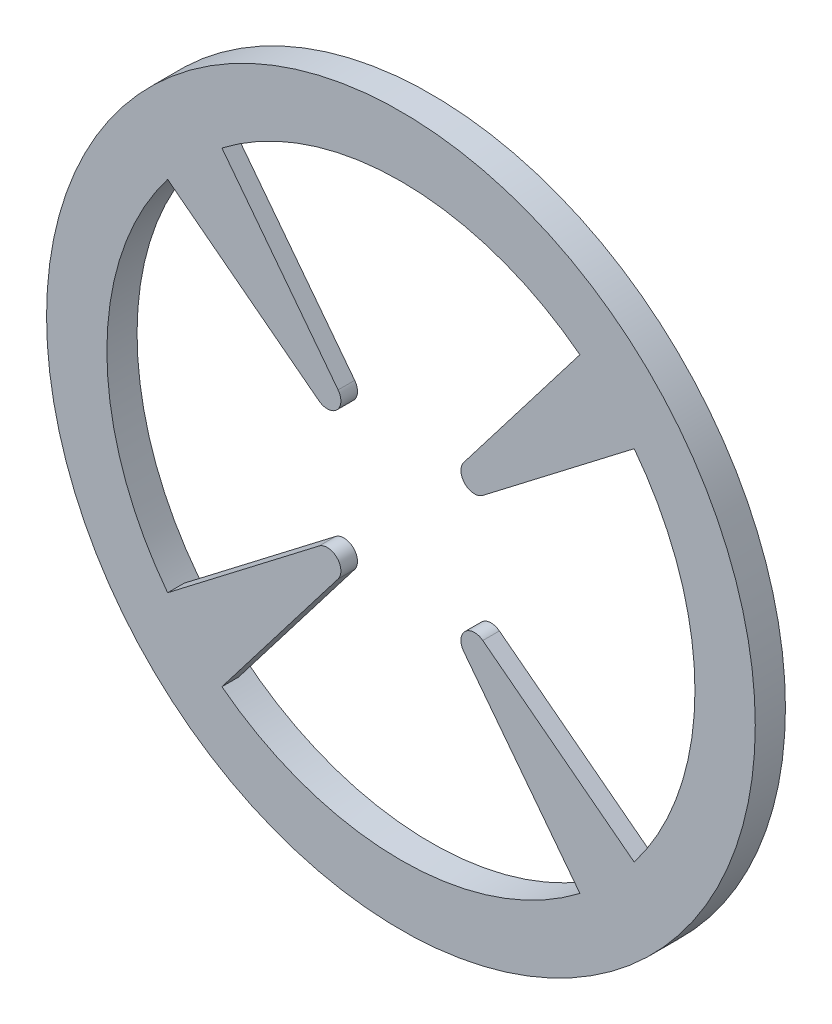
ISO-10303-21;
HEADER;
FILE_DESCRIPTION(('STEP AP214'),'2;1');
FILE_NAME('part.step','',(''),(''),'','','');
FILE_SCHEMA(('AUTOMOTIVE_DESIGN { 1 0 10303 214 1 1 1 1 }'));
ENDSEC;
DATA;
#1=APPLICATION_CONTEXT('core data for automotive mechanical design processes');
#2=APPLICATION_PROTOCOL_DEFINITION('international standard','automotive_design',2000,#1);
#3=PRODUCT_CONTEXT('',#1,'mechanical');
#4=PRODUCT('Part','Part','',(#3));
#5=PRODUCT_RELATED_PRODUCT_CATEGORY('part','',(#4));
#6=PRODUCT_DEFINITION_FORMATION('','',#4);
#7=PRODUCT_DEFINITION_CONTEXT('part definition',#1,'design');
#8=PRODUCT_DEFINITION('design','',#6,#7);
#9=PRODUCT_DEFINITION_SHAPE('','',#8);
#10=(LENGTH_UNIT() NAMED_UNIT(*) SI_UNIT(.MILLI.,.METRE.));
#11=(NAMED_UNIT(*) PLANE_ANGLE_UNIT() SI_UNIT($,.RADIAN.));
#12=(NAMED_UNIT(*) SI_UNIT($,.STERADIAN.) SOLID_ANGLE_UNIT());
#13=UNCERTAINTY_MEASURE_WITH_UNIT(LENGTH_MEASURE(1.E-05),#10,'distance_accuracy_value','');
#14=(GEOMETRIC_REPRESENTATION_CONTEXT(3) GLOBAL_UNCERTAINTY_ASSIGNED_CONTEXT((#13)) GLOBAL_UNIT_ASSIGNED_CONTEXT((#10,
#11,#12)) REPRESENTATION_CONTEXT('',''));
#15=CARTESIAN_POINT('',(0.,0.,0.));
#16=DIRECTION('',(0.,0.,1.));
#17=DIRECTION('',(1.,0.,0.));
#18=AXIS2_PLACEMENT_3D('',#15,#16,#17);
#19=CARTESIAN_POINT('',(0.,0.,0.1));
#20=DIRECTION('',(0.,0.,-1.));
#21=DIRECTION('',(-1.,0.,0.));
#22=AXIS2_PLACEMENT_3D('',#19,#20,#21);
#23=CYLINDRICAL_SURFACE('',#22,0.974760425432156);
#24=CARTESIAN_POINT('',(0.,0.,0.));
#25=DIRECTION('',(0.,0.,1.));
#26=DIRECTION('',(1.,0.,0.));
#27=AXIS2_PLACEMENT_3D('',#24,#25,#26);
#28=CIRCLE('',#27,0.974760425432156);
#29=CARTESIAN_POINT('',(0.974760425432156,0.,0.));
#30=VERTEX_POINT('',#29);
#31=EDGE_CURVE('E320',#30,#30,#28,.T.);
#32=ORIENTED_EDGE('',*,*,#31,.F.);
#33=EDGE_LOOP('',(#32));
#34=FACE_BOUND('',#33,.T.);
#35=CARTESIAN_POINT('',(0.,0.,0.045));
#36=DIRECTION('',(0.,0.,1.));
#37=DIRECTION('',(1.,0.,0.));
#38=AXIS2_PLACEMENT_3D('',#35,#36,#37);
#39=CIRCLE('',#38,0.974760425432156);
#40=CARTESIAN_POINT('',(-0.593396549527234,-0.773329439500302,0.045));
#41=VERTEX_POINT('',#40);
#42=CARTESIAN_POINT('',(-0.773329439500312,-0.593396549527221,0.045));
#43=VERTEX_POINT('',#42);
#44=EDGE_CURVE('E61',#41,#43,#39,.F.);
#45=ORIENTED_EDGE('',*,*,#44,.F.);
#46=DIRECTION('',(0.,0.,1.));
#47=VECTOR('',#46,1.);
#48=CARTESIAN_POINT('',(-0.593396549527234,-0.773329439500302,0.045));
#49=LINE('',#48,#47);
#50=CARTESIAN_POINT('',(-0.593396549527234,-0.773329439500302,0.1));
#51=VERTEX_POINT('',#50);
#52=EDGE_CURVE('E199',#41,#51,#49,.T.);
#53=ORIENTED_EDGE('',*,*,#52,.T.);
#54=CARTESIAN_POINT('',(0.,0.,0.1));
#55=DIRECTION('',(0.,0.,1.));
#56=DIRECTION('',(1.,0.,0.));
#57=AXIS2_PLACEMENT_3D('',#54,#55,#56);
#58=CIRCLE('',#57,0.974760425432156);
#59=CARTESIAN_POINT('',(0.593396549527224,-0.77332943950031,0.1));
#60=VERTEX_POINT('',#59);
#61=EDGE_CURVE('E333',#51,#60,#58,.T.);
#62=ORIENTED_EDGE('',*,*,#61,.T.);
#63=DIRECTION('',(0.,0.,1.));
#64=VECTOR('',#63,1.);
#65=CARTESIAN_POINT('',(0.593396549527224,-0.77332943950031,0.045));
#66=LINE('',#65,#64);
#67=CARTESIAN_POINT('',(0.593396549527224,-0.77332943950031,0.045));
#68=VERTEX_POINT('',#67);
#69=EDGE_CURVE('E237',#68,#60,#66,.T.);
#70=ORIENTED_EDGE('',*,*,#69,.F.);
#71=CARTESIAN_POINT('',(0.,0.,0.045));
#72=DIRECTION('',(0.,0.,1.));
#73=DIRECTION('',(1.,0.,0.));
#74=AXIS2_PLACEMENT_3D('',#71,#72,#73);
#75=CIRCLE('',#74,0.974760425432156);
#76=CARTESIAN_POINT('',(0.773329439500304,-0.593396549527231,0.045));
#77=VERTEX_POINT('',#76);
#78=EDGE_CURVE('E217',#77,#68,#75,.F.);
#79=ORIENTED_EDGE('',*,*,#78,.F.);
#80=DIRECTION('',(0.,0.,1.));
#81=VECTOR('',#80,1.);
#82=CARTESIAN_POINT('',(0.773329439500304,-0.593396549527231,0.045));
#83=LINE('',#82,#81);
#84=CARTESIAN_POINT('',(0.773329439500304,-0.593396549527231,0.1));
#85=VERTEX_POINT('',#84);
#86=EDGE_CURVE('E232',#77,#85,#83,.T.);
#87=ORIENTED_EDGE('',*,*,#86,.T.);
#88=CARTESIAN_POINT('',(0.773329439500308,0.593396549527226,0.1));
#89=VERTEX_POINT('',#88);
#90=EDGE_CURVE('E340',#85,#89,#58,.T.);
#91=ORIENTED_EDGE('',*,*,#90,.T.);
#92=DIRECTION('',(0.,0.,1.));
#93=VECTOR('',#92,1.);
#94=CARTESIAN_POINT('',(0.773329439500308,0.593396549527226,0.045));
#95=LINE('',#94,#93);
#96=CARTESIAN_POINT('',(0.773329439500308,0.593396549527226,0.045));
#97=VERTEX_POINT('',#96);
#98=EDGE_CURVE('E279',#97,#89,#95,.T.);
#99=ORIENTED_EDGE('',*,*,#98,.F.);
#100=CARTESIAN_POINT('',(0.,0.,0.045));
#101=DIRECTION('',(0.,0.,1.));
#102=DIRECTION('',(1.,0.,0.));
#103=AXIS2_PLACEMENT_3D('',#100,#101,#102);
#104=CIRCLE('',#103,0.974760425432156);
#105=CARTESIAN_POINT('',(0.593396549527228,0.773329439500306,0.045));
#106=VERTEX_POINT('',#105);
#107=EDGE_CURVE('E259',#106,#97,#104,.F.);
#108=ORIENTED_EDGE('',*,*,#107,.F.);
#109=DIRECTION('',(0.,0.,1.));
#110=VECTOR('',#109,1.);
#111=CARTESIAN_POINT('',(0.593396549527228,0.773329439500306,0.045));
#112=LINE('',#111,#110);
#113=CARTESIAN_POINT('',(0.593396549527228,0.773329439500306,0.1));
#114=VERTEX_POINT('',#113);
#115=EDGE_CURVE('E274',#106,#114,#112,.T.);
#116=ORIENTED_EDGE('',*,*,#115,.T.);
#117=CARTESIAN_POINT('',(-0.593396549527218,0.773329439500314,0.1));
#118=VERTEX_POINT('',#117);
#119=EDGE_CURVE('E334',#114,#118,#58,.T.);
#120=ORIENTED_EDGE('',*,*,#119,.T.);
#121=DIRECTION('',(0.,0.,1.));
#122=VECTOR('',#121,1.);
#123=CARTESIAN_POINT('',(-0.593396549527218,0.773329439500314,0.045));
#124=LINE('',#123,#122);
#125=CARTESIAN_POINT('',(-0.593396549527218,0.773329439500314,0.045));
#126=VERTEX_POINT('',#125);
#127=EDGE_CURVE('E321',#126,#118,#124,.T.);
#128=ORIENTED_EDGE('',*,*,#127,.F.);
#129=CARTESIAN_POINT('',(0.,0.,0.045));
#130=DIRECTION('',(0.,0.,1.));
#131=DIRECTION('',(1.,0.,0.));
#132=AXIS2_PLACEMENT_3D('',#129,#130,#131);
#133=CIRCLE('',#132,0.974760425432156);
#134=CARTESIAN_POINT('',(-0.7733294395003,0.593396549527237,0.045));
#135=VERTEX_POINT('',#134);
#136=EDGE_CURVE('E301',#135,#126,#133,.F.);
#137=ORIENTED_EDGE('',*,*,#136,.F.);
#138=DIRECTION('',(0.,0.,1.));
#139=VECTOR('',#138,1.);
#140=CARTESIAN_POINT('',(-0.7733294395003,0.593396549527237,0.045));
#141=LINE('',#140,#139);
#142=CARTESIAN_POINT('',(-0.7733294395003,0.593396549527237,0.1));
#143=VERTEX_POINT('',#142);
#144=EDGE_CURVE('E316',#135,#143,#141,.T.);
#145=ORIENTED_EDGE('',*,*,#144,.T.);
#146=CARTESIAN_POINT('',(-0.773329439500312,-0.593396549527221,0.1));
#147=VERTEX_POINT('',#146);
#148=EDGE_CURVE('E330',#143,#147,#58,.T.);
#149=ORIENTED_EDGE('',*,*,#148,.T.);
#150=DIRECTION('',(0.,0.,1.));
#151=VECTOR('',#150,1.);
#152=CARTESIAN_POINT('',(-0.773329439500312,-0.593396549527221,0.045));
#153=LINE('',#152,#151);
#154=EDGE_CURVE('E66',#43,#147,#153,.T.);
#155=ORIENTED_EDGE('',*,*,#154,.F.);
#156=EDGE_LOOP('',(#45,#53,#62,#70,#79,#87,#91,#99,#108,#116,#120,#128,#137,#145,#149,#155));
#157=FACE_BOUND('',#156,.T.);
#158=ADVANCED_FACE('F45',(#34,#157),#23,.F.);
#159=CARTESIAN_POINT('',(0.,0.,0.1));
#160=DIRECTION('',(0.,0.,1.));
#161=DIRECTION('',(1.,0.,0.));
#162=AXIS2_PLACEMENT_3D('',#159,#160,#161);
#163=PLANE('',#162);
#164=CARTESIAN_POINT('',(0.,0.,0.1));
#165=DIRECTION('',(0.,0.,1.));
#166=DIRECTION('',(1.,0.,0.));
#167=AXIS2_PLACEMENT_3D('',#164,#165,#166);
#168=CIRCLE('',#167,1.17476042543216);
#169=CARTESIAN_POINT('',(1.17476042543216,0.,0.1));
#170=VERTEX_POINT('',#169);
#171=EDGE_CURVE('E11',#170,#170,#168,.T.);
#172=ORIENTED_EDGE('',*,*,#171,.T.);
#173=EDGE_LOOP('',(#172));
#174=FACE_BOUND('',#173,.T.);
#175=ORIENTED_EDGE('',*,*,#148,.F.);
#176=DIRECTION('',(-0.793353340291228,0.608761429008729,0.));
#177=VECTOR('',#176,1.);
#178=CARTESIAN_POINT('',(0.,0.,0.1));
#179=LINE('',#178,#177);
#180=CARTESIAN_POINT('',(-0.271393831112811,0.208247810983869,0.1));
#181=VERTEX_POINT('',#180);
#182=EDGE_CURVE('E278',#181,#143,#179,.T.);
#183=ORIENTED_EDGE('',*,*,#182,.F.);
#184=CARTESIAN_POINT('',(-0.243977486679677,0.243977486679683,0.1));
#185=DIRECTION('',(0.,0.,1.));
#186=DIRECTION('',(1.,0.,0.));
#187=AXIS2_PLACEMENT_3D('',#184,#185,#186);
#188=CIRCLE('',#187,0.0450362705761065);
#189=CARTESIAN_POINT('',(-0.208247810983862,0.271393831112816,0.1));
#190=VERTEX_POINT('',#189);
#191=EDGE_CURVE('E309',#181,#190,#188,.T.);
#192=ORIENTED_EDGE('',*,*,#191,.T.);
#193=DIRECTION('',(-0.608761429008711,0.793353340291243,0.));
#194=VECTOR('',#193,1.);
#195=CARTESIAN_POINT('',(0.,0.,0.1));
#196=LINE('',#195,#194);
#197=EDGE_CURVE('E293',#190,#118,#196,.T.);
#198=ORIENTED_EDGE('',*,*,#197,.T.);
#199=ORIENTED_EDGE('',*,*,#119,.F.);
#200=DIRECTION('',(0.608761429008721,0.793353340291235,0.));
#201=VECTOR('',#200,1.);
#202=CARTESIAN_POINT('',(0.,0.,0.1));
#203=LINE('',#202,#201);
#204=CARTESIAN_POINT('',(0.208247810983866,0.271393831112813,0.1));
#205=VERTEX_POINT('',#204);
#206=EDGE_CURVE('E236',#205,#114,#203,.T.);
#207=ORIENTED_EDGE('',*,*,#206,.F.);
#208=CARTESIAN_POINT('',(0.24397748667968,0.243977486679679,0.1));
#209=DIRECTION('',(0.,0.,1.));
#210=DIRECTION('',(1.,0.,0.));
#211=AXIS2_PLACEMENT_3D('',#208,#209,#210);
#212=CIRCLE('',#211,0.0450362705761065);
#213=CARTESIAN_POINT('',(0.271393831112814,0.208247810983865,0.1));
#214=VERTEX_POINT('',#213);
#215=EDGE_CURVE('E267',#205,#214,#212,.T.);
#216=ORIENTED_EDGE('',*,*,#215,.T.);
#217=DIRECTION('',(0.793353340291236,0.608761429008719,0.));
#218=VECTOR('',#217,1.);
#219=CARTESIAN_POINT('',(0.,0.,0.1));
#220=LINE('',#219,#218);
#221=EDGE_CURVE('E251',#214,#89,#220,.T.);
#222=ORIENTED_EDGE('',*,*,#221,.T.);
#223=ORIENTED_EDGE('',*,*,#90,.F.);
#224=DIRECTION('',(0.793353340291233,-0.608761429008724,0.));
#225=VECTOR('',#224,1.);
#226=CARTESIAN_POINT('',(0.,0.,0.1));
#227=LINE('',#226,#225);
#228=CARTESIAN_POINT('',(0.271393831112813,-0.208247810983867,0.1));
#229=VERTEX_POINT('',#228);
#230=EDGE_CURVE('E198',#229,#85,#227,.T.);
#231=ORIENTED_EDGE('',*,*,#230,.F.);
#232=CARTESIAN_POINT('',(0.243977486679678,-0.243977486679681,0.1));
#233=DIRECTION('',(0.,0.,1.));
#234=DIRECTION('',(1.,0.,0.));
#235=AXIS2_PLACEMENT_3D('',#232,#233,#234);
#236=CIRCLE('',#235,0.0450362705761065);
#237=CARTESIAN_POINT('',(0.208247810983864,-0.271393831112815,0.1));
#238=VERTEX_POINT('',#237);
#239=EDGE_CURVE('E225',#229,#238,#236,.T.);
#240=ORIENTED_EDGE('',*,*,#239,.T.);
#241=DIRECTION('',(0.608761429008716,-0.793353340291238,0.));
#242=VECTOR('',#241,1.);
#243=CARTESIAN_POINT('',(0.,0.,0.1));
#244=LINE('',#243,#242);
#245=EDGE_CURVE('E209',#238,#60,#244,.T.);
#246=ORIENTED_EDGE('',*,*,#245,.T.);
#247=ORIENTED_EDGE('',*,*,#61,.F.);
#248=DIRECTION('',(-0.608761429008727,-0.793353340291231,0.));
#249=VECTOR('',#248,1.);
#250=CARTESIAN_POINT('',(0.,0.,0.1));
#251=LINE('',#250,#249);
#252=CARTESIAN_POINT('',(-0.208247810983868,-0.271393831112812,0.1));
#253=VERTEX_POINT('',#252);
#254=EDGE_CURVE('E181',#253,#51,#251,.T.);
#255=ORIENTED_EDGE('',*,*,#254,.F.);
#256=CARTESIAN_POINT('',(-0.243977486679682,-0.243977486679678,0.1));
#257=DIRECTION('',(0.,0.,1.));
#258=DIRECTION('',(1.,0.,0.));
#259=AXIS2_PLACEMENT_3D('',#256,#257,#258);
#260=CIRCLE('',#259,0.0450362705761065);
#261=CARTESIAN_POINT('',(-0.271393831112815,-0.208247810983863,0.1));
#262=VERTEX_POINT('',#261);
#263=EDGE_CURVE('E191',#253,#262,#260,.T.);
#264=ORIENTED_EDGE('',*,*,#263,.T.);
#265=DIRECTION('',(-0.793353340291241,-0.608761429008714,0.));
#266=VECTOR('',#265,1.);
#267=CARTESIAN_POINT('',(0.,0.,0.1));
#268=LINE('',#267,#266);
#269=EDGE_CURVE('E163',#262,#147,#268,.T.);
#270=ORIENTED_EDGE('',*,*,#269,.T.);
#271=EDGE_LOOP('',(#175,#183,#192,#198,#199,#207,#216,#222,#223,#231,#240,#246,#247,#255,#264,#270));
#272=FACE_BOUND('',#271,.T.);
#273=ADVANCED_FACE('F350',(#174,#272),#163,.T.);
#274=CARTESIAN_POINT('',(0.,0.,0.));
#275=DIRECTION('',(0.,0.,1.));
#276=DIRECTION('',(1.,0.,0.));
#277=AXIS2_PLACEMENT_3D('',#274,#275,#276);
#278=PLANE('',#277);
#279=CARTESIAN_POINT('',(0.,0.,0.));
#280=DIRECTION('',(0.,0.,1.));
#281=DIRECTION('',(1.,0.,0.));
#282=AXIS2_PLACEMENT_3D('',#279,#280,#281);
#283=CIRCLE('',#282,1.17476042543216);
#284=CARTESIAN_POINT('',(1.17476042543216,0.,0.));
#285=VERTEX_POINT('',#284);
#286=EDGE_CURVE('E49',#285,#285,#283,.T.);
#287=ORIENTED_EDGE('',*,*,#286,.F.);
#288=EDGE_LOOP('',(#287));
#289=FACE_BOUND('',#288,.T.);
#290=ORIENTED_EDGE('',*,*,#31,.T.);
#291=EDGE_LOOP('',(#290));
#292=FACE_BOUND('',#291,.T.);
#293=ADVANCED_FACE('F380',(#289,#292),#278,.F.);
#294=CARTESIAN_POINT('',(0.,0.,0.1));
#295=DIRECTION('',(0.,0.,-1.));
#296=DIRECTION('',(-1.,0.,0.));
#297=AXIS2_PLACEMENT_3D('',#294,#295,#296);
#298=CYLINDRICAL_SURFACE('',#297,1.17476042543216);
#299=ORIENTED_EDGE('',*,*,#171,.F.);
#300=EDGE_LOOP('',(#299));
#301=FACE_BOUND('',#300,.T.);
#302=ORIENTED_EDGE('',*,*,#286,.T.);
#303=EDGE_LOOP('',(#302));
#304=FACE_BOUND('',#303,.T.);
#305=ADVANCED_FACE('F47',(#301,#304),#298,.T.);
#306=CARTESIAN_POINT('',(0.,0.,0.045));
#307=DIRECTION('',(0.608761429008729,0.793353340291228,0.));
#308=DIRECTION('',(-0.793353340291228,0.608761429008729,0.));
#309=AXIS2_PLACEMENT_3D('',#306,#307,#308);
#310=PLANE('',#309);
#311=ORIENTED_EDGE('',*,*,#182,.T.);
#312=ORIENTED_EDGE('',*,*,#144,.F.);
#313=DIRECTION('',(-0.793353340291228,0.608761429008729,0.));
#314=VECTOR('',#313,1.);
#315=CARTESIAN_POINT('',(0.,0.,0.045));
#316=LINE('',#315,#314);
#317=CARTESIAN_POINT('',(-0.271393831112811,0.208247810983869,0.045));
#318=VERTEX_POINT('',#317);
#319=EDGE_CURVE('E288',#318,#135,#316,.T.);
#320=ORIENTED_EDGE('',*,*,#319,.F.);
#321=DIRECTION('',(0.,0.,1.));
#322=VECTOR('',#321,1.);
#323=CARTESIAN_POINT('',(-0.271393831112811,0.208247810983869,0.045));
#324=LINE('',#323,#322);
#325=EDGE_CURVE('E305',#318,#181,#324,.T.);
#326=ORIENTED_EDGE('',*,*,#325,.T.);
#327=EDGE_LOOP('',(#311,#312,#320,#326));
#328=FACE_BOUND('',#327,.T.);
#329=ADVANCED_FACE('F384',(#328),#310,.F.);
#330=CARTESIAN_POINT('',(0.,0.,0.045));
#331=DIRECTION('',(0.793353340291243,0.608761429008711,0.));
#332=DIRECTION('',(-0.608761429008711,0.793353340291243,0.));
#333=AXIS2_PLACEMENT_3D('',#330,#331,#332);
#334=PLANE('',#333);
#335=ORIENTED_EDGE('',*,*,#197,.F.);
#336=DIRECTION('',(0.,0.,1.));
#337=VECTOR('',#336,1.);
#338=CARTESIAN_POINT('',(-0.208247810983862,0.271393831112816,0.045));
#339=LINE('',#338,#337);
#340=CARTESIAN_POINT('',(-0.208247810983862,0.271393831112816,0.045));
#341=VERTEX_POINT('',#340);
#342=EDGE_CURVE('E325',#341,#190,#339,.T.);
#343=ORIENTED_EDGE('',*,*,#342,.F.);
#344=DIRECTION('',(-0.608761429008711,0.793353340291243,0.));
#345=VECTOR('',#344,1.);
#346=CARTESIAN_POINT('',(0.,0.,0.045));
#347=LINE('',#346,#345);
#348=EDGE_CURVE('E297',#341,#126,#347,.T.);
#349=ORIENTED_EDGE('',*,*,#348,.T.);
#350=ORIENTED_EDGE('',*,*,#127,.T.);
#351=EDGE_LOOP('',(#335,#343,#349,#350));
#352=FACE_BOUND('',#351,.T.);
#353=ADVANCED_FACE('F399',(#352),#334,.T.);
#354=CARTESIAN_POINT('',(-0.243977486679677,0.243977486679683,0.045));
#355=DIRECTION('',(0.,0.,1.));
#356=DIRECTION('',(1.,0.,0.));
#357=AXIS2_PLACEMENT_3D('',#354,#355,#356);
#358=CYLINDRICAL_SURFACE('',#357,0.0450362705761065);
#359=ORIENTED_EDGE('',*,*,#191,.F.);
#360=ORIENTED_EDGE('',*,*,#325,.F.);
#361=CARTESIAN_POINT('',(-0.243977486679677,0.243977486679683,0.045));
#362=DIRECTION('',(0.,0.,1.));
#363=DIRECTION('',(1.,0.,0.));
#364=AXIS2_PLACEMENT_3D('',#361,#362,#363);
#365=CIRCLE('',#364,0.0450362705761065);
#366=EDGE_CURVE('E292',#318,#341,#365,.T.);
#367=ORIENTED_EDGE('',*,*,#366,.T.);
#368=ORIENTED_EDGE('',*,*,#342,.T.);
#369=EDGE_LOOP('',(#359,#360,#367,#368));
#370=FACE_BOUND('',#369,.T.);
#371=ADVANCED_FACE('F405',(#370),#358,.T.);
#372=CARTESIAN_POINT('',(0.,0.,0.045));
#373=DIRECTION('',(0.,0.,1.));
#374=DIRECTION('',(1.,0.,0.));
#375=AXIS2_PLACEMENT_3D('',#372,#373,#374);
#376=PLANE('',#375);
#377=ORIENTED_EDGE('',*,*,#319,.T.);
#378=ORIENTED_EDGE('',*,*,#136,.T.);
#379=ORIENTED_EDGE('',*,*,#348,.F.);
#380=ORIENTED_EDGE('',*,*,#366,.F.);
#381=EDGE_LOOP('',(#377,#378,#379,#380));
#382=FACE_BOUND('',#381,.T.);
#383=ADVANCED_FACE('F435',(#382),#376,.F.);
#384=CARTESIAN_POINT('',(0.,0.,0.045));
#385=DIRECTION('',(0.793353340291235,-0.608761429008721,0.));
#386=DIRECTION('',(0.608761429008721,0.793353340291235,0.));
#387=AXIS2_PLACEMENT_3D('',#384,#385,#386);
#388=PLANE('',#387);
#389=ORIENTED_EDGE('',*,*,#206,.T.);
#390=ORIENTED_EDGE('',*,*,#115,.F.);
#391=DIRECTION('',(0.608761429008721,0.793353340291235,0.));
#392=VECTOR('',#391,1.);
#393=CARTESIAN_POINT('',(0.,0.,0.045));
#394=LINE('',#393,#392);
#395=CARTESIAN_POINT('',(0.208247810983866,0.271393831112813,0.045));
#396=VERTEX_POINT('',#395);
#397=EDGE_CURVE('E246',#396,#106,#394,.T.);
#398=ORIENTED_EDGE('',*,*,#397,.F.);
#399=DIRECTION('',(0.,0.,1.));
#400=VECTOR('',#399,1.);
#401=CARTESIAN_POINT('',(0.208247810983866,0.271393831112813,0.045));
#402=LINE('',#401,#400);
#403=EDGE_CURVE('E263',#396,#205,#402,.T.);
#404=ORIENTED_EDGE('',*,*,#403,.T.);
#405=EDGE_LOOP('',(#389,#390,#398,#404));
#406=FACE_BOUND('',#405,.T.);
#407=ADVANCED_FACE('F421',(#406),#388,.F.);
#408=CARTESIAN_POINT('',(0.,0.,0.045));
#409=DIRECTION('',(0.608761429008719,-0.793353340291236,0.));
#410=DIRECTION('',(0.793353340291236,0.608761429008719,0.));
#411=AXIS2_PLACEMENT_3D('',#408,#409,#410);
#412=PLANE('',#411);
#413=ORIENTED_EDGE('',*,*,#221,.F.);
#414=DIRECTION('',(0.,0.,1.));
#415=VECTOR('',#414,1.);
#416=CARTESIAN_POINT('',(0.271393831112814,0.208247810983865,0.045));
#417=LINE('',#416,#415);
#418=CARTESIAN_POINT('',(0.271393831112814,0.208247810983865,0.045));
#419=VERTEX_POINT('',#418);
#420=EDGE_CURVE('E283',#419,#214,#417,.T.);
#421=ORIENTED_EDGE('',*,*,#420,.F.);
#422=DIRECTION('',(0.793353340291236,0.608761429008719,0.));
#423=VECTOR('',#422,1.);
#424=CARTESIAN_POINT('',(0.,0.,0.045));
#425=LINE('',#424,#423);
#426=EDGE_CURVE('E255',#419,#97,#425,.T.);
#427=ORIENTED_EDGE('',*,*,#426,.T.);
#428=ORIENTED_EDGE('',*,*,#98,.T.);
#429=EDGE_LOOP('',(#413,#421,#427,#428));
#430=FACE_BOUND('',#429,.T.);
#431=ADVANCED_FACE('F426',(#430),#412,.T.);
#432=CARTESIAN_POINT('',(0.24397748667968,0.243977486679679,0.045));
#433=DIRECTION('',(0.,0.,1.));
#434=DIRECTION('',(1.,0.,0.));
#435=AXIS2_PLACEMENT_3D('',#432,#433,#434);
#436=CYLINDRICAL_SURFACE('',#435,0.0450362705761065);
#437=ORIENTED_EDGE('',*,*,#215,.F.);
#438=ORIENTED_EDGE('',*,*,#403,.F.);
#439=CARTESIAN_POINT('',(0.24397748667968,0.243977486679679,0.045));
#440=DIRECTION('',(0.,0.,1.));
#441=DIRECTION('',(1.,0.,0.));
#442=AXIS2_PLACEMENT_3D('',#439,#440,#441);
#443=CIRCLE('',#442,0.0450362705761065);
#444=EDGE_CURVE('E250',#396,#419,#443,.T.);
#445=ORIENTED_EDGE('',*,*,#444,.T.);
#446=ORIENTED_EDGE('',*,*,#420,.T.);
#447=EDGE_LOOP('',(#437,#438,#445,#446));
#448=FACE_BOUND('',#447,.T.);
#449=ADVANCED_FACE('F370',(#448),#436,.T.);
#450=CARTESIAN_POINT('',(0.,0.,0.045));
#451=DIRECTION('',(0.,0.,1.));
#452=DIRECTION('',(1.,0.,0.));
#453=AXIS2_PLACEMENT_3D('',#450,#451,#452);
#454=PLANE('',#453);
#455=ORIENTED_EDGE('',*,*,#397,.T.);
#456=ORIENTED_EDGE('',*,*,#107,.T.);
#457=ORIENTED_EDGE('',*,*,#426,.F.);
#458=ORIENTED_EDGE('',*,*,#444,.F.);
#459=EDGE_LOOP('',(#455,#456,#457,#458));
#460=FACE_BOUND('',#459,.T.);
#461=ADVANCED_FACE('F363',(#460),#454,.F.);
#462=CARTESIAN_POINT('',(0.,0.,0.045));
#463=DIRECTION('',(-0.608761429008724,-0.793353340291233,0.));
#464=DIRECTION('',(0.793353340291233,-0.608761429008724,0.));
#465=AXIS2_PLACEMENT_3D('',#462,#463,#464);
#466=PLANE('',#465);
#467=ORIENTED_EDGE('',*,*,#230,.T.);
#468=ORIENTED_EDGE('',*,*,#86,.F.);
#469=DIRECTION('',(0.793353340291233,-0.608761429008724,0.));
#470=VECTOR('',#469,1.);
#471=CARTESIAN_POINT('',(0.,0.,0.045));
#472=LINE('',#471,#470);
#473=CARTESIAN_POINT('',(0.271393831112813,-0.208247810983867,0.045));
#474=VERTEX_POINT('',#473);
#475=EDGE_CURVE('E204',#474,#77,#472,.T.);
#476=ORIENTED_EDGE('',*,*,#475,.F.);
#477=DIRECTION('',(0.,0.,1.));
#478=VECTOR('',#477,1.);
#479=CARTESIAN_POINT('',(0.271393831112813,-0.208247810983867,0.045));
#480=LINE('',#479,#478);
#481=EDGE_CURVE('E221',#474,#229,#480,.T.);
#482=ORIENTED_EDGE('',*,*,#481,.T.);
#483=EDGE_LOOP('',(#467,#468,#476,#482));
#484=FACE_BOUND('',#483,.T.);
#485=ADVANCED_FACE('F361',(#484),#466,.F.);
#486=CARTESIAN_POINT('',(0.,0.,0.045));
#487=DIRECTION('',(-0.793353340291238,-0.608761429008716,0.));
#488=DIRECTION('',(0.608761429008716,-0.793353340291238,0.));
#489=AXIS2_PLACEMENT_3D('',#486,#487,#488);
#490=PLANE('',#489);
#491=ORIENTED_EDGE('',*,*,#245,.F.);
#492=DIRECTION('',(0.,0.,1.));
#493=VECTOR('',#492,1.);
#494=CARTESIAN_POINT('',(0.208247810983864,-0.271393831112815,0.045));
#495=LINE('',#494,#493);
#496=CARTESIAN_POINT('',(0.208247810983864,-0.271393831112815,0.045));
#497=VERTEX_POINT('',#496);
#498=EDGE_CURVE('E241',#497,#238,#495,.T.);
#499=ORIENTED_EDGE('',*,*,#498,.F.);
#500=DIRECTION('',(0.608761429008716,-0.793353340291238,0.));
#501=VECTOR('',#500,1.);
#502=CARTESIAN_POINT('',(0.,0.,0.045));
#503=LINE('',#502,#501);
#504=EDGE_CURVE('E213',#497,#68,#503,.T.);
#505=ORIENTED_EDGE('',*,*,#504,.T.);
#506=ORIENTED_EDGE('',*,*,#69,.T.);
#507=EDGE_LOOP('',(#491,#499,#505,#506));
#508=FACE_BOUND('',#507,.T.);
#509=ADVANCED_FACE('F348',(#508),#490,.T.);
#510=CARTESIAN_POINT('',(0.243977486679678,-0.243977486679681,0.045));
#511=DIRECTION('',(0.,0.,1.));
#512=DIRECTION('',(1.,0.,0.));
#513=AXIS2_PLACEMENT_3D('',#510,#511,#512);
#514=CYLINDRICAL_SURFACE('',#513,0.0450362705761065);
#515=ORIENTED_EDGE('',*,*,#239,.F.);
#516=ORIENTED_EDGE('',*,*,#481,.F.);
#517=CARTESIAN_POINT('',(0.243977486679678,-0.243977486679681,0.045));
#518=DIRECTION('',(0.,0.,1.));
#519=DIRECTION('',(1.,0.,0.));
#520=AXIS2_PLACEMENT_3D('',#517,#518,#519);
#521=CIRCLE('',#520,0.0450362705761065);
#522=EDGE_CURVE('E208',#474,#497,#521,.T.);
#523=ORIENTED_EDGE('',*,*,#522,.T.);
#524=ORIENTED_EDGE('',*,*,#498,.T.);
#525=EDGE_LOOP('',(#515,#516,#523,#524));
#526=FACE_BOUND('',#525,.T.);
#527=ADVANCED_FACE('F354',(#526),#514,.T.);
#528=CARTESIAN_POINT('',(0.,0.,0.045));
#529=DIRECTION('',(0.,0.,1.));
#530=DIRECTION('',(1.,0.,0.));
#531=AXIS2_PLACEMENT_3D('',#528,#529,#530);
#532=PLANE('',#531);
#533=ORIENTED_EDGE('',*,*,#475,.T.);
#534=ORIENTED_EDGE('',*,*,#78,.T.);
#535=ORIENTED_EDGE('',*,*,#504,.F.);
#536=ORIENTED_EDGE('',*,*,#522,.F.);
#537=EDGE_LOOP('',(#533,#534,#535,#536));
#538=FACE_BOUND('',#537,.T.);
#539=ADVANCED_FACE('F358',(#538),#532,.F.);
#540=CARTESIAN_POINT('',(-0.243977486679682,-0.243977486679678,0.045));
#541=DIRECTION('',(0.,0.,1.));
#542=DIRECTION('',(1.,0.,0.));
#543=AXIS2_PLACEMENT_3D('',#540,#541,#542);
#544=CYLINDRICAL_SURFACE('',#543,0.0450362705761065);
#545=ORIENTED_EDGE('',*,*,#263,.F.);
#546=DIRECTION('',(0.,0.,1.));
#547=VECTOR('',#546,1.);
#548=CARTESIAN_POINT('',(-0.208247810983868,-0.271393831112812,0.045));
#549=LINE('',#548,#547);
#550=CARTESIAN_POINT('',(-0.208247810983868,-0.271393831112812,0.045));
#551=VERTEX_POINT('',#550);
#552=EDGE_CURVE('E178',#551,#253,#549,.T.);
#553=ORIENTED_EDGE('',*,*,#552,.F.);
#554=CARTESIAN_POINT('',(-0.243977486679682,-0.243977486679678,0.045));
#555=DIRECTION('',(0.,0.,1.));
#556=DIRECTION('',(1.,0.,0.));
#557=AXIS2_PLACEMENT_3D('',#554,#555,#556);
#558=CIRCLE('',#557,0.0450362705761065);
#559=CARTESIAN_POINT('',(-0.271393831112815,-0.208247810983863,0.045));
#560=VERTEX_POINT('',#559);
#561=EDGE_CURVE('E174',#551,#560,#558,.T.);
#562=ORIENTED_EDGE('',*,*,#561,.T.);
#563=DIRECTION('',(0.,0.,1.));
#564=VECTOR('',#563,1.);
#565=CARTESIAN_POINT('',(-0.271393831112815,-0.208247810983863,0.045));
#566=LINE('',#565,#564);
#567=EDGE_CURVE('E158',#560,#262,#566,.T.);
#568=ORIENTED_EDGE('',*,*,#567,.T.);
#569=EDGE_LOOP('',(#545,#553,#562,#568));
#570=FACE_BOUND('',#569,.T.);
#571=ADVANCED_FACE('F177',(#570),#544,.T.);
#572=CARTESIAN_POINT('',(0.,0.,0.045));
#573=DIRECTION('',(-0.793353340291231,0.608761429008727,0.));
#574=DIRECTION('',(-0.608761429008727,-0.793353340291231,0.));
#575=AXIS2_PLACEMENT_3D('',#572,#573,#574);
#576=PLANE('',#575);
#577=ORIENTED_EDGE('',*,*,#254,.T.);
#578=ORIENTED_EDGE('',*,*,#52,.F.);
#579=DIRECTION('',(-0.608761429008727,-0.793353340291231,0.));
#580=VECTOR('',#579,1.);
#581=CARTESIAN_POINT('',(0.,0.,0.045));
#582=LINE('',#581,#580);
#583=EDGE_CURVE('E169',#551,#41,#582,.T.);
#584=ORIENTED_EDGE('',*,*,#583,.F.);
#585=ORIENTED_EDGE('',*,*,#552,.T.);
#586=EDGE_LOOP('',(#577,#578,#584,#585));
#587=FACE_BOUND('',#586,.T.);
#588=ADVANCED_FACE('F511',(#587),#576,.F.);
#589=CARTESIAN_POINT('',(0.,0.,0.045));
#590=DIRECTION('',(-0.608761429008714,0.793353340291241,0.));
#591=DIRECTION('',(-0.793353340291241,-0.608761429008714,0.));
#592=AXIS2_PLACEMENT_3D('',#589,#590,#591);
#593=PLANE('',#592);
#594=ORIENTED_EDGE('',*,*,#269,.F.);
#595=ORIENTED_EDGE('',*,*,#567,.F.);
#596=DIRECTION('',(-0.793353340291241,-0.608761429008714,0.));
#597=VECTOR('',#596,1.);
#598=CARTESIAN_POINT('',(0.,0.,0.045));
#599=LINE('',#598,#597);
#600=EDGE_CURVE('E161',#560,#43,#599,.T.);
#601=ORIENTED_EDGE('',*,*,#600,.T.);
#602=ORIENTED_EDGE('',*,*,#154,.T.);
#603=EDGE_LOOP('',(#594,#595,#601,#602));
#604=FACE_BOUND('',#603,.T.);
#605=ADVANCED_FACE('F160',(#604),#593,.T.);
#606=CARTESIAN_POINT('',(0.,0.,0.045));
#607=DIRECTION('',(0.,0.,1.));
#608=DIRECTION('',(1.,0.,0.));
#609=AXIS2_PLACEMENT_3D('',#606,#607,#608);
#610=PLANE('',#609);
#611=ORIENTED_EDGE('',*,*,#561,.F.);
#612=ORIENTED_EDGE('',*,*,#583,.T.);
#613=ORIENTED_EDGE('',*,*,#44,.T.);
#614=ORIENTED_EDGE('',*,*,#600,.F.);
#615=EDGE_LOOP('',(#611,#612,#613,#614));
#616=FACE_BOUND('',#615,.T.);
#617=ADVANCED_FACE('F173',(#616),#610,.F.);
#618=CLOSED_SHELL('',(#158,#273,#293,#305,#329,#353,#371,#383,#407,#431,#449,#461,#485,#509,
#527,#539,#571,#588,#605,#617));
#619=MANIFOLD_SOLID_BREP('B2',#618);
#620=ADVANCED_BREP_SHAPE_REPRESENTATION('',(#18,#619),#14);
#621=SHAPE_DEFINITION_REPRESENTATION(#9,#620);
ENDSEC;
END-ISO-10303-21;
